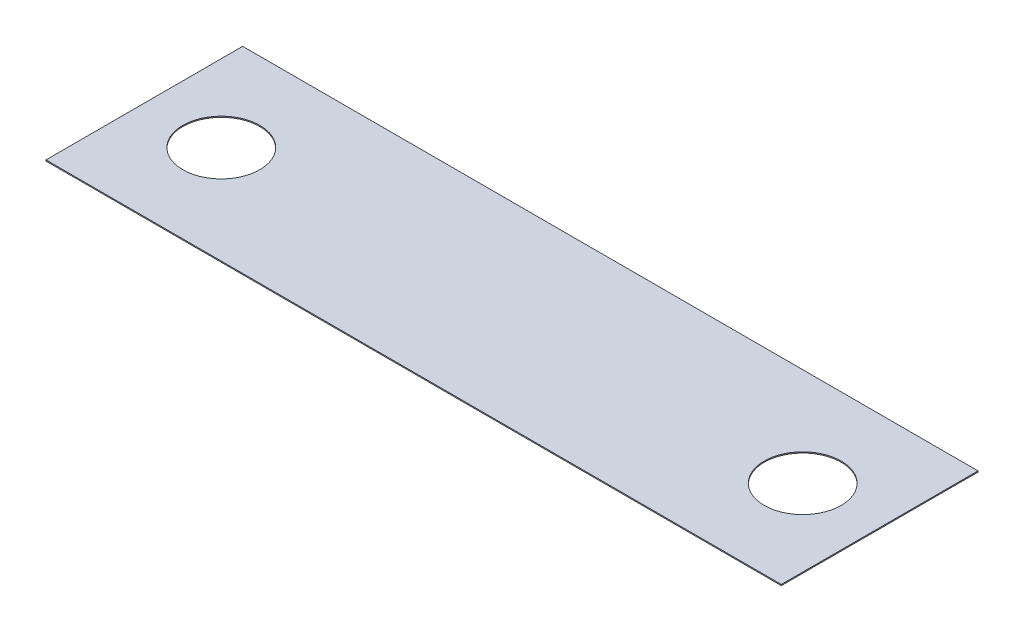
ISO-10303-21;
HEADER;
FILE_DESCRIPTION(('STEP AP214'),'2;1');
FILE_NAME('part.step','',(''),(''),'','','');
FILE_SCHEMA(('AUTOMOTIVE_DESIGN { 1 0 10303 214 1 1 1 1 }'));
ENDSEC;
DATA;
#1=APPLICATION_CONTEXT('core data for automotive mechanical design processes');
#2=APPLICATION_PROTOCOL_DEFINITION('international standard','automotive_design',2000,#1);
#3=PRODUCT_CONTEXT('',#1,'mechanical');
#4=PRODUCT('Part','Part','',(#3));
#5=PRODUCT_RELATED_PRODUCT_CATEGORY('part','',(#4));
#6=PRODUCT_DEFINITION_FORMATION('','',#4);
#7=PRODUCT_DEFINITION_CONTEXT('part definition',#1,'design');
#8=PRODUCT_DEFINITION('design','',#6,#7);
#9=PRODUCT_DEFINITION_SHAPE('','',#8);
#10=(LENGTH_UNIT() NAMED_UNIT(*) SI_UNIT(.MILLI.,.METRE.));
#11=(NAMED_UNIT(*) PLANE_ANGLE_UNIT() SI_UNIT($,.RADIAN.));
#12=(NAMED_UNIT(*) SI_UNIT($,.STERADIAN.) SOLID_ANGLE_UNIT());
#13=UNCERTAINTY_MEASURE_WITH_UNIT(LENGTH_MEASURE(1.E-05),#10,'distance_accuracy_value','');
#14=(GEOMETRIC_REPRESENTATION_CONTEXT(3) GLOBAL_UNCERTAINTY_ASSIGNED_CONTEXT((#13)) GLOBAL_UNIT_ASSIGNED_CONTEXT((#10,
#11,#12)) REPRESENTATION_CONTEXT('',''));
#15=CARTESIAN_POINT('',(0.,0.,0.));
#16=DIRECTION('',(0.,0.,1.));
#17=DIRECTION('',(1.,0.,0.));
#18=AXIS2_PLACEMENT_3D('',#15,#16,#17);
#19=CARTESIAN_POINT('',(0.,0.127,0.));
#20=DIRECTION('',(1.,0.,0.));
#21=DIRECTION('',(0.,0.,-1.));
#22=AXIS2_PLACEMENT_3D('',#19,#20,#21);
#23=PLANE('',#22);
#24=DIRECTION('',(0.,0.,1.));
#25=VECTOR('',#24,1.);
#26=CARTESIAN_POINT('',(0.,0.,0.));
#27=LINE('',#26,#25);
#28=CARTESIAN_POINT('',(0.,0.,-23.));
#29=VERTEX_POINT('',#28);
#30=CARTESIAN_POINT('',(0.,0.,0.));
#31=VERTEX_POINT('',#30);
#32=EDGE_CURVE('E97',#29,#31,#27,.T.);
#33=ORIENTED_EDGE('',*,*,#32,.T.);
#34=DIRECTION('',(0.,-1.,0.));
#35=VECTOR('',#34,1.);
#36=CARTESIAN_POINT('',(0.,0.127,0.));
#37=LINE('',#36,#35);
#38=CARTESIAN_POINT('',(0.,0.127,0.));
#39=VERTEX_POINT('',#38);
#40=EDGE_CURVE('E11',#39,#31,#37,.T.);
#41=ORIENTED_EDGE('',*,*,#40,.F.);
#42=DIRECTION('',(0.,0.,1.));
#43=VECTOR('',#42,1.);
#44=CARTESIAN_POINT('',(0.,0.127,0.));
#45=LINE('',#44,#43);
#46=CARTESIAN_POINT('',(0.,0.127,-23.));
#47=VERTEX_POINT('',#46);
#48=EDGE_CURVE('E85',#47,#39,#45,.T.);
#49=ORIENTED_EDGE('',*,*,#48,.F.);
#50=DIRECTION('',(0.,-1.,0.));
#51=VECTOR('',#50,1.);
#52=CARTESIAN_POINT('',(0.,0.127,-23.));
#53=LINE('',#52,#51);
#54=EDGE_CURVE('E93',#47,#29,#53,.T.);
#55=ORIENTED_EDGE('',*,*,#54,.T.);
#56=EDGE_LOOP('',(#33,#41,#49,#55));
#57=FACE_BOUND('',#56,.T.);
#58=ADVANCED_FACE('F34',(#57),#23,.F.);
#59=CARTESIAN_POINT('',(0.,0.127,0.));
#60=DIRECTION('',(0.,0.,-1.));
#61=DIRECTION('',(-1.,0.,0.));
#62=AXIS2_PLACEMENT_3D('',#59,#60,#61);
#63=PLANE('',#62);
#64=DIRECTION('',(1.,0.,0.));
#65=VECTOR('',#64,1.);
#66=CARTESIAN_POINT('',(0.,0.,0.));
#67=LINE('',#66,#65);
#68=CARTESIAN_POINT('',(86.,0.,0.));
#69=VERTEX_POINT('',#68);
#70=EDGE_CURVE('E89',#31,#69,#67,.T.);
#71=ORIENTED_EDGE('',*,*,#70,.T.);
#72=DIRECTION('',(0.,-1.,0.));
#73=VECTOR('',#72,1.);
#74=CARTESIAN_POINT('',(86.,0.127,0.));
#75=LINE('',#74,#73);
#76=CARTESIAN_POINT('',(86.,0.127,0.));
#77=VERTEX_POINT('',#76);
#78=EDGE_CURVE('E42',#77,#69,#75,.T.);
#79=ORIENTED_EDGE('',*,*,#78,.F.);
#80=DIRECTION('',(1.,0.,0.));
#81=VECTOR('',#80,1.);
#82=CARTESIAN_POINT('',(0.,0.127,0.));
#83=LINE('',#82,#81);
#84=EDGE_CURVE('E80',#39,#77,#83,.T.);
#85=ORIENTED_EDGE('',*,*,#84,.F.);
#86=ORIENTED_EDGE('',*,*,#40,.T.);
#87=EDGE_LOOP('',(#71,#79,#85,#86));
#88=FACE_BOUND('',#87,.T.);
#89=ADVANCED_FACE('F88',(#88),#63,.F.);
#90=CARTESIAN_POINT('',(86.,0.127,0.));
#91=DIRECTION('',(-1.,0.,0.));
#92=DIRECTION('',(0.,0.,1.));
#93=AXIS2_PLACEMENT_3D('',#90,#91,#92);
#94=PLANE('',#93);
#95=DIRECTION('',(0.,0.,-1.));
#96=VECTOR('',#95,1.);
#97=CARTESIAN_POINT('',(86.,0.,0.));
#98=LINE('',#97,#96);
#99=CARTESIAN_POINT('',(86.,0.,-23.));
#100=VERTEX_POINT('',#99);
#101=EDGE_CURVE('E67',#69,#100,#98,.T.);
#102=ORIENTED_EDGE('',*,*,#101,.T.);
#103=DIRECTION('',(0.,-1.,0.));
#104=VECTOR('',#103,1.);
#105=CARTESIAN_POINT('',(86.,0.127,-23.));
#106=LINE('',#105,#104);
#107=CARTESIAN_POINT('',(86.,0.127,-23.));
#108=VERTEX_POINT('',#107);
#109=EDGE_CURVE('E90',#108,#100,#106,.T.);
#110=ORIENTED_EDGE('',*,*,#109,.F.);
#111=DIRECTION('',(0.,0.,-1.));
#112=VECTOR('',#111,1.);
#113=CARTESIAN_POINT('',(86.,0.127,0.));
#114=LINE('',#113,#112);
#115=EDGE_CURVE('E83',#77,#108,#114,.T.);
#116=ORIENTED_EDGE('',*,*,#115,.F.);
#117=ORIENTED_EDGE('',*,*,#78,.T.);
#118=EDGE_LOOP('',(#102,#110,#116,#117));
#119=FACE_BOUND('',#118,.T.);
#120=ADVANCED_FACE('F91',(#119),#94,.F.);
#121=CARTESIAN_POINT('',(0.,0.127,-23.));
#122=DIRECTION('',(0.,0.,1.));
#123=DIRECTION('',(1.,0.,0.));
#124=AXIS2_PLACEMENT_3D('',#121,#122,#123);
#125=PLANE('',#124);
#126=DIRECTION('',(-1.,0.,0.));
#127=VECTOR('',#126,1.);
#128=CARTESIAN_POINT('',(0.,0.,-23.));
#129=LINE('',#128,#127);
#130=EDGE_CURVE('E73',#100,#29,#129,.T.);
#131=ORIENTED_EDGE('',*,*,#130,.T.);
#132=ORIENTED_EDGE('',*,*,#54,.F.);
#133=DIRECTION('',(-1.,0.,0.));
#134=VECTOR('',#133,1.);
#135=CARTESIAN_POINT('',(0.,0.127,-23.));
#136=LINE('',#135,#134);
#137=EDGE_CURVE('E50',#108,#47,#136,.T.);
#138=ORIENTED_EDGE('',*,*,#137,.F.);
#139=ORIENTED_EDGE('',*,*,#109,.T.);
#140=EDGE_LOOP('',(#131,#132,#138,#139));
#141=FACE_BOUND('',#140,.T.);
#142=ADVANCED_FACE('F105',(#141),#125,.F.);
#143=CARTESIAN_POINT('',(0.,0.127,-23.));
#144=DIRECTION('',(0.,-1.,0.));
#145=DIRECTION('',(0.,0.,-1.));
#146=AXIS2_PLACEMENT_3D('',#143,#144,#145);
#147=PLANE('',#146);
#148=CARTESIAN_POINT('',(8.99999999999999,0.127000000000001,-11.5));
#149=DIRECTION('',(0.,1.,0.));
#150=DIRECTION('',(0.,0.,1.));
#151=AXIS2_PLACEMENT_3D('',#148,#149,#150);
#152=CIRCLE('',#151,4.49999999999999);
#153=CARTESIAN_POINT('',(8.99999999999999,0.127000000000001,-7.));
#154=VERTEX_POINT('',#153);
#155=EDGE_CURVE('E119',#154,#154,#152,.T.);
#156=ORIENTED_EDGE('',*,*,#155,.F.);
#157=EDGE_LOOP('',(#156));
#158=FACE_BOUND('',#157,.T.);
#159=CARTESIAN_POINT('',(77.,0.127000000000001,-11.5));
#160=DIRECTION('',(0.,1.,0.));
#161=DIRECTION('',(0.,0.,1.));
#162=AXIS2_PLACEMENT_3D('',#159,#160,#161);
#163=CIRCLE('',#162,4.49999999999999);
#164=CARTESIAN_POINT('',(77.,0.127000000000001,-7.00000000000001));
#165=VERTEX_POINT('',#164);
#166=EDGE_CURVE('E113',#165,#165,#163,.T.);
#167=ORIENTED_EDGE('',*,*,#166,.F.);
#168=EDGE_LOOP('',(#167));
#169=FACE_BOUND('',#168,.T.);
#170=ORIENTED_EDGE('',*,*,#48,.T.);
#171=ORIENTED_EDGE('',*,*,#84,.T.);
#172=ORIENTED_EDGE('',*,*,#115,.T.);
#173=ORIENTED_EDGE('',*,*,#137,.T.);
#174=EDGE_LOOP('',(#170,#171,#172,#173));
#175=FACE_BOUND('',#174,.T.);
#176=ADVANCED_FACE('F81',(#158,#169,#175),#147,.F.);
#177=CARTESIAN_POINT('',(0.,0.,-23.));
#178=DIRECTION('',(0.,-1.,0.));
#179=DIRECTION('',(0.,0.,-1.));
#180=AXIS2_PLACEMENT_3D('',#177,#178,#179);
#181=PLANE('',#180);
#182=CARTESIAN_POINT('',(8.99999999999999,0.,-11.5));
#183=DIRECTION('',(0.,1.,0.));
#184=DIRECTION('',(0.,0.,1.));
#185=AXIS2_PLACEMENT_3D('',#182,#183,#184);
#186=CIRCLE('',#185,4.5);
#187=CARTESIAN_POINT('',(8.99999999999999,0.,-6.99999999999999));
#188=VERTEX_POINT('',#187);
#189=EDGE_CURVE('E116',#188,#188,#186,.T.);
#190=ORIENTED_EDGE('',*,*,#189,.T.);
#191=EDGE_LOOP('',(#190));
#192=FACE_BOUND('',#191,.T.);
#193=CARTESIAN_POINT('',(77.,0.,-11.5));
#194=DIRECTION('',(0.,1.,0.));
#195=DIRECTION('',(0.,0.,1.));
#196=AXIS2_PLACEMENT_3D('',#193,#194,#195);
#197=CIRCLE('',#196,4.5);
#198=CARTESIAN_POINT('',(77.,0.,-7.));
#199=VERTEX_POINT('',#198);
#200=EDGE_CURVE('E100',#199,#199,#197,.T.);
#201=ORIENTED_EDGE('',*,*,#200,.T.);
#202=EDGE_LOOP('',(#201));
#203=FACE_BOUND('',#202,.T.);
#204=ORIENTED_EDGE('',*,*,#32,.F.);
#205=ORIENTED_EDGE('',*,*,#130,.F.);
#206=ORIENTED_EDGE('',*,*,#101,.F.);
#207=ORIENTED_EDGE('',*,*,#70,.F.);
#208=EDGE_LOOP('',(#204,#205,#206,#207));
#209=FACE_BOUND('',#208,.T.);
#210=ADVANCED_FACE('F108',(#192,#203,#209),#181,.T.);
#211=CARTESIAN_POINT('',(77.,0.127,-11.5));
#212=DIRECTION('',(0.,1.,0.));
#213=DIRECTION('',(0.,0.,1.));
#214=AXIS2_PLACEMENT_3D('',#211,#212,#213);
#215=CYLINDRICAL_SURFACE('',#214,4.5);
#216=ORIENTED_EDGE('',*,*,#200,.F.);
#217=EDGE_LOOP('',(#216));
#218=FACE_BOUND('',#217,.T.);
#219=ORIENTED_EDGE('',*,*,#166,.T.);
#220=EDGE_LOOP('',(#219));
#221=FACE_BOUND('',#220,.T.);
#222=ADVANCED_FACE('F130',(#218,#221),#215,.F.);
#223=CARTESIAN_POINT('',(8.99999999999999,0.127,-11.5));
#224=DIRECTION('',(0.,1.,0.));
#225=DIRECTION('',(0.,0.,1.));
#226=AXIS2_PLACEMENT_3D('',#223,#224,#225);
#227=CYLINDRICAL_SURFACE('',#226,4.49999999999999);
#228=ORIENTED_EDGE('',*,*,#189,.F.);
#229=EDGE_LOOP('',(#228));
#230=FACE_BOUND('',#229,.T.);
#231=ORIENTED_EDGE('',*,*,#155,.T.);
#232=EDGE_LOOP('',(#231));
#233=FACE_BOUND('',#232,.T.);
#234=ADVANCED_FACE('F123',(#230,#233),#227,.F.);
#235=CLOSED_SHELL('',(#58,#89,#120,#142,#176,#210,#222,#234));
#236=MANIFOLD_SOLID_BREP('B2',#235);
#237=ADVANCED_BREP_SHAPE_REPRESENTATION('',(#18,#236),#14);
#238=SHAPE_DEFINITION_REPRESENTATION(#9,#237);
ENDSEC;
END-ISO-10303-21;
